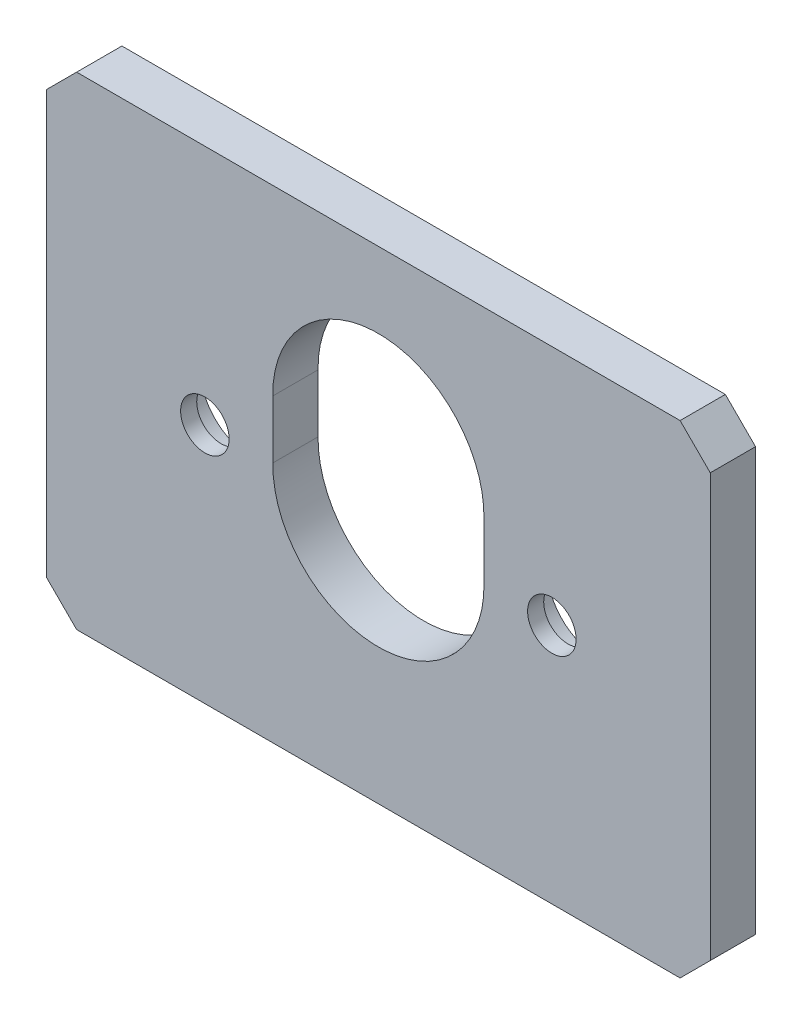
ISO-10303-21;
HEADER;
FILE_DESCRIPTION(('STEP AP214'),'2;1');
FILE_NAME('part.step','',(''),(''),'','','');
FILE_SCHEMA(('AUTOMOTIVE_DESIGN { 1 0 10303 214 1 1 1 1 }'));
ENDSEC;
DATA;
#1=APPLICATION_CONTEXT('core data for automotive mechanical design processes');
#2=APPLICATION_PROTOCOL_DEFINITION('international standard','automotive_design',2000,#1);
#3=PRODUCT_CONTEXT('',#1,'mechanical');
#4=PRODUCT('Part','Part','',(#3));
#5=PRODUCT_RELATED_PRODUCT_CATEGORY('part','',(#4));
#6=PRODUCT_DEFINITION_FORMATION('','',#4);
#7=PRODUCT_DEFINITION_CONTEXT('part definition',#1,'design');
#8=PRODUCT_DEFINITION('design','',#6,#7);
#9=PRODUCT_DEFINITION_SHAPE('','',#8);
#10=(LENGTH_UNIT() NAMED_UNIT(*) SI_UNIT(.MILLI.,.METRE.));
#11=(NAMED_UNIT(*) PLANE_ANGLE_UNIT() SI_UNIT($,.RADIAN.));
#12=(NAMED_UNIT(*) SI_UNIT($,.STERADIAN.) SOLID_ANGLE_UNIT());
#13=UNCERTAINTY_MEASURE_WITH_UNIT(LENGTH_MEASURE(1.E-05),#10,'distance_accuracy_value','');
#14=(GEOMETRIC_REPRESENTATION_CONTEXT(3) GLOBAL_UNCERTAINTY_ASSIGNED_CONTEXT((#13)) GLOBAL_UNIT_ASSIGNED_CONTEXT((#10,
#11,#12)) REPRESENTATION_CONTEXT('',''));
#15=CARTESIAN_POINT('',(0.,0.,0.));
#16=DIRECTION('',(0.,0.,1.));
#17=DIRECTION('',(1.,0.,0.));
#18=AXIS2_PLACEMENT_3D('',#15,#16,#17);
#19=CARTESIAN_POINT('',(707.110462480762,389.179264608464,2.38125));
#20=DIRECTION('',(0.,0.,1.));
#21=DIRECTION('',(1.,0.,0.));
#22=AXIS2_PLACEMENT_3D('',#19,#20,#21);
#23=CYLINDRICAL_SURFACE('',#22,2.5527);
#24=CARTESIAN_POINT('',(707.110462480762,389.179264608464,4.7625));
#25=DIRECTION('',(0.,0.,1.));
#26=DIRECTION('',(1.,0.,0.));
#27=AXIS2_PLACEMENT_3D('',#24,#25,#26);
#28=CIRCLE('',#27,2.5527);
#29=CARTESIAN_POINT('',(709.663162480762,389.179264608464,4.7625));
#30=VERTEX_POINT('',#29);
#31=EDGE_CURVE('E164',#30,#30,#28,.F.);
#32=ORIENTED_EDGE('',*,*,#31,.F.);
#33=EDGE_LOOP('',(#32));
#34=FACE_BOUND('',#33,.T.);
#35=CARTESIAN_POINT('',(707.110462480762,389.179264608464,3.06832));
#36=DIRECTION('',(0.,0.,-1.));
#37=DIRECTION('',(-1.,0.,0.));
#38=AXIS2_PLACEMENT_3D('',#35,#36,#37);
#39=CIRCLE('',#38,2.5527);
#40=CARTESIAN_POINT('',(704.557762480762,389.179264608464,3.06832));
#41=VERTEX_POINT('',#40);
#42=EDGE_CURVE('E43',#41,#41,#39,.F.);
#43=ORIENTED_EDGE('',*,*,#42,.F.);
#44=EDGE_LOOP('',(#43));
#45=FACE_BOUND('',#44,.T.);
#46=ADVANCED_FACE('F39',(#34,#45),#23,.F.);
#47=CARTESIAN_POINT('',(670.597962480762,389.179264608464,2.38125));
#48=DIRECTION('',(0.,0.,1.));
#49=DIRECTION('',(1.,0.,0.));
#50=AXIS2_PLACEMENT_3D('',#47,#48,#49);
#51=CYLINDRICAL_SURFACE('',#50,2.5527);
#52=CARTESIAN_POINT('',(670.597962480762,389.179264608464,4.7625));
#53=DIRECTION('',(0.,0.,1.));
#54=DIRECTION('',(1.,0.,0.));
#55=AXIS2_PLACEMENT_3D('',#52,#53,#54);
#56=CIRCLE('',#55,2.5527);
#57=CARTESIAN_POINT('',(673.150662480762,389.179264608464,4.7625));
#58=VERTEX_POINT('',#57);
#59=EDGE_CURVE('E161',#58,#58,#56,.F.);
#60=ORIENTED_EDGE('',*,*,#59,.F.);
#61=EDGE_LOOP('',(#60));
#62=FACE_BOUND('',#61,.T.);
#63=CARTESIAN_POINT('',(670.597962480762,389.179264608464,3.06832));
#64=DIRECTION('',(0.,0.,-1.));
#65=DIRECTION('',(-1.,0.,0.));
#66=AXIS2_PLACEMENT_3D('',#63,#64,#65);
#67=CIRCLE('',#66,2.5527);
#68=CARTESIAN_POINT('',(668.045262480762,389.179264608464,3.06832));
#69=VERTEX_POINT('',#68);
#70=EDGE_CURVE('E137',#69,#69,#67,.F.);
#71=ORIENTED_EDGE('',*,*,#70,.F.);
#72=EDGE_LOOP('',(#71));
#73=FACE_BOUND('',#72,.T.);
#74=ADVANCED_FACE('F287',(#62,#73),#51,.F.);
#75=CARTESIAN_POINT('',(688.854212480761,389.179264608464,0.));
#76=DIRECTION('',(0.,0.,1.));
#77=DIRECTION('',(1.,0.,0.));
#78=AXIS2_PLACEMENT_3D('',#75,#76,#77);
#79=PLANE('',#78);
#80=CARTESIAN_POINT('',(688.854212480761,395.529264608464,0.));
#81=DIRECTION('',(0.,0.,1.));
#82=DIRECTION('',(1.,0.,0.));
#83=AXIS2_PLACEMENT_3D('',#80,#81,#82);
#84=CIRCLE('',#83,11.1125);
#85=CARTESIAN_POINT('',(699.963010285383,395.242441342267,0.));
#86=VERTEX_POINT('',#85);
#87=CARTESIAN_POINT('',(677.742619883526,395.387256851397,0.));
#88=VERTEX_POINT('',#87);
#89=EDGE_CURVE('E168',#86,#88,#84,.T.);
#90=ORIENTED_EDGE('',*,*,#89,.T.);
#91=DIRECTION('',(-7.2259303567E-05,-0.999999997389297,0.));
#92=VECTOR('',#91,1.);
#93=CARTESIAN_POINT('',(677.742164059357,389.079084119593,0.));
#94=LINE('',#93,#92);
#95=CARTESIAN_POINT('',(677.742178653342,389.281050994053,0.));
#96=VERTEX_POINT('',#95);
#97=EDGE_CURVE('E83',#88,#96,#94,.T.);
#98=ORIENTED_EDGE('',*,*,#97,.T.);
#99=CARTESIAN_POINT('',(688.854212480761,389.179264608464,0.));
#100=DIRECTION('',(0.,0.,1.));
#101=DIRECTION('',(1.,0.,0.));
#102=AXIS2_PLACEMENT_3D('',#99,#100,#101);
#103=CIRCLE('',#102,11.1125);
#104=CARTESIAN_POINT('',(699.964756665355,389.387745236307,0.));
#105=VERTEX_POINT('',#104);
#106=EDGE_CURVE('E155',#96,#105,#103,.T.);
#107=ORIENTED_EDGE('',*,*,#106,.T.);
#108=DIRECTION('',(-0.000298287026866,0.999999955512424,0.));
#109=VECTOR('',#108,1.);
#110=CARTESIAN_POINT('',(699.962837197258,395.822715043866,0.));
#111=LINE('',#110,#109);
#112=EDGE_CURVE('E89',#105,#86,#111,.T.);
#113=ORIENTED_EDGE('',*,*,#112,.T.);
#114=EDGE_LOOP('',(#90,#98,#107,#113));
#115=FACE_BOUND('',#114,.T.);
#116=CARTESIAN_POINT('',(670.597962480762,389.179264608464,0.));
#117=DIRECTION('',(0.,0.,-1.));
#118=DIRECTION('',(-1.,0.,0.));
#119=AXIS2_PLACEMENT_3D('',#116,#117,#118);
#120=CIRCLE('',#119,5.21969999877492);
#121=CARTESIAN_POINT('',(665.378262481987,389.179264608464,0.));
#122=VERTEX_POINT('',#121);
#123=EDGE_CURVE('E181',#122,#122,#120,.T.);
#124=ORIENTED_EDGE('',*,*,#123,.F.);
#125=EDGE_LOOP('',(#124));
#126=FACE_BOUND('',#125,.T.);
#127=CARTESIAN_POINT('',(707.110462480762,389.179264608464,0.));
#128=DIRECTION('',(0.,0.,-1.));
#129=DIRECTION('',(-1.,0.,0.));
#130=AXIS2_PLACEMENT_3D('',#127,#128,#129);
#131=CIRCLE('',#130,5.21969999873288);
#132=CARTESIAN_POINT('',(701.890762482029,389.179264608464,0.));
#133=VERTEX_POINT('',#132);
#134=EDGE_CURVE('E189',#133,#133,#131,.T.);
#135=ORIENTED_EDGE('',*,*,#134,.F.);
#136=EDGE_LOOP('',(#135));
#137=FACE_BOUND('',#136,.T.);
#138=DIRECTION('',(1.,0.,0.));
#139=VECTOR('',#138,1.);
#140=CARTESIAN_POINT('',(653.929212480761,414.579264608464,0.));
#141=LINE('',#140,#139);
#142=CARTESIAN_POINT('',(720.604212480762,414.579264608464,0.));
#143=VERTEX_POINT('',#142);
#144=CARTESIAN_POINT('',(657.104212480761,414.579264608464,0.));
#145=VERTEX_POINT('',#144);
#146=EDGE_CURVE('E153',#143,#145,#141,.F.);
#147=ORIENTED_EDGE('',*,*,#146,.F.);
#148=DIRECTION('',(-0.70710678118654,0.707106781186555,0.));
#149=VECTOR('',#148,1.);
#150=CARTESIAN_POINT('',(722.191712480762,412.991764608464,0.));
#151=LINE('',#150,#149);
#152=CARTESIAN_POINT('',(723.779212480762,411.404264608464,0.));
#153=VERTEX_POINT('',#152);
#154=EDGE_CURVE('E97',#153,#143,#151,.T.);
#155=ORIENTED_EDGE('',*,*,#154,.F.);
#156=DIRECTION('',(0.,1.,0.));
#157=VECTOR('',#156,1.);
#158=CARTESIAN_POINT('',(723.779212480762,414.579264608464,0.));
#159=LINE('',#158,#157);
#160=CARTESIAN_POINT('',(723.779212480762,366.954264608464,0.));
#161=VERTEX_POINT('',#160);
#162=EDGE_CURVE('E227',#161,#153,#159,.T.);
#163=ORIENTED_EDGE('',*,*,#162,.F.);
#164=DIRECTION('',(0.70710678118654,0.707106781186555,0.));
#165=VECTOR('',#164,1.);
#166=CARTESIAN_POINT('',(722.191712480762,365.366764608464,0.));
#167=LINE('',#166,#165);
#168=CARTESIAN_POINT('',(720.604212480762,363.779264608464,0.));
#169=VERTEX_POINT('',#168);
#170=EDGE_CURVE('E232',#169,#161,#167,.T.);
#171=ORIENTED_EDGE('',*,*,#170,.F.);
#172=DIRECTION('',(1.,0.,0.));
#173=VECTOR('',#172,1.);
#174=CARTESIAN_POINT('',(723.779212480762,363.779264608464,0.));
#175=LINE('',#174,#173);
#176=CARTESIAN_POINT('',(657.104212480761,363.779264608464,0.));
#177=VERTEX_POINT('',#176);
#178=EDGE_CURVE('E237',#177,#169,#175,.T.);
#179=ORIENTED_EDGE('',*,*,#178,.F.);
#180=DIRECTION('',(0.70710678118654,-0.707106781186555,0.));
#181=VECTOR('',#180,1.);
#182=CARTESIAN_POINT('',(655.516712480761,365.366764608464,0.));
#183=LINE('',#182,#181);
#184=CARTESIAN_POINT('',(653.929212480761,366.954264608464,0.));
#185=VERTEX_POINT('',#184);
#186=EDGE_CURVE('E140',#185,#177,#183,.T.);
#187=ORIENTED_EDGE('',*,*,#186,.F.);
#188=DIRECTION('',(0.,1.,0.));
#189=VECTOR('',#188,1.);
#190=CARTESIAN_POINT('',(653.929212480761,363.779264608464,0.));
#191=LINE('',#190,#189);
#192=CARTESIAN_POINT('',(653.929212480761,411.404264608464,0.));
#193=VERTEX_POINT('',#192);
#194=EDGE_CURVE('E122',#193,#185,#191,.F.);
#195=ORIENTED_EDGE('',*,*,#194,.F.);
#196=DIRECTION('',(-0.70710678118654,-0.707106781186555,0.));
#197=VECTOR('',#196,1.);
#198=CARTESIAN_POINT('',(655.516712480761,412.991764608464,0.));
#199=LINE('',#198,#197);
#200=EDGE_CURVE('E128',#145,#193,#199,.T.);
#201=ORIENTED_EDGE('',*,*,#200,.F.);
#202=EDGE_LOOP('',(#147,#155,#163,#171,#179,#187,#195,#201));
#203=FACE_BOUND('',#202,.T.);
#204=ADVANCED_FACE('F41',(#115,#126,#137,#203),#79,.F.);
#205=CARTESIAN_POINT('',(655.516712480761,412.991764608464,0.));
#206=DIRECTION('',(-0.707106781186555,0.70710678118654,0.));
#207=DIRECTION('',(-0.70710678118654,-0.707106781186555,0.));
#208=AXIS2_PLACEMENT_3D('',#205,#206,#207);
#209=PLANE('',#208);
#210=ORIENTED_EDGE('',*,*,#200,.T.);
#211=DIRECTION('',(0.,0.,1.));
#212=VECTOR('',#211,1.);
#213=CARTESIAN_POINT('',(653.929212480761,411.404264608464,0.));
#214=LINE('',#213,#212);
#215=CARTESIAN_POINT('',(653.929212480761,411.404264608464,4.7625));
#216=VERTEX_POINT('',#215);
#217=EDGE_CURVE('E131',#216,#193,#214,.F.);
#218=ORIENTED_EDGE('',*,*,#217,.F.);
#219=DIRECTION('',(-0.707106781186541,-0.707106781186554,0.));
#220=VECTOR('',#219,1.);
#221=CARTESIAN_POINT('',(657.104212480761,414.579264608464,4.7625));
#222=LINE('',#221,#220);
#223=CARTESIAN_POINT('',(657.104212480761,414.579264608464,4.7625));
#224=VERTEX_POINT('',#223);
#225=EDGE_CURVE('E170',#224,#216,#222,.T.);
#226=ORIENTED_EDGE('',*,*,#225,.F.);
#227=DIRECTION('',(0.,0.,1.));
#228=VECTOR('',#227,1.);
#229=CARTESIAN_POINT('',(657.104212480761,414.579264608464,0.));
#230=LINE('',#229,#228);
#231=EDGE_CURVE('E134',#145,#224,#230,.T.);
#232=ORIENTED_EDGE('',*,*,#231,.F.);
#233=EDGE_LOOP('',(#210,#218,#226,#232));
#234=FACE_BOUND('',#233,.T.);
#235=ADVANCED_FACE('F129',(#234),#209,.T.);
#236=CARTESIAN_POINT('',(653.929212480761,363.779264608464,0.));
#237=DIRECTION('',(-1.,0.,0.));
#238=DIRECTION('',(0.,0.,1.));
#239=AXIS2_PLACEMENT_3D('',#236,#237,#238);
#240=PLANE('',#239);
#241=DIRECTION('',(0.,0.,1.));
#242=VECTOR('',#241,1.);
#243=CARTESIAN_POINT('',(653.929212480761,366.954264608464,0.));
#244=LINE('',#243,#242);
#245=CARTESIAN_POINT('',(653.929212480761,366.954264608464,4.7625));
#246=VERTEX_POINT('',#245);
#247=EDGE_CURVE('E142',#246,#185,#244,.F.);
#248=ORIENTED_EDGE('',*,*,#247,.F.);
#249=DIRECTION('',(0.,1.,0.));
#250=VECTOR('',#249,1.);
#251=CARTESIAN_POINT('',(653.929212480761,389.179264608464,4.7625));
#252=LINE('',#251,#250);
#253=EDGE_CURVE('E146',#216,#246,#252,.F.);
#254=ORIENTED_EDGE('',*,*,#253,.F.);
#255=ORIENTED_EDGE('',*,*,#217,.T.);
#256=ORIENTED_EDGE('',*,*,#194,.T.);
#257=EDGE_LOOP('',(#248,#254,#255,#256));
#258=FACE_BOUND('',#257,.T.);
#259=ADVANCED_FACE('F144',(#258),#240,.T.);
#260=CARTESIAN_POINT('',(655.516712480761,365.366764608464,0.));
#261=DIRECTION('',(-0.707106781186555,-0.70710678118654,0.));
#262=DIRECTION('',(0.70710678118654,-0.707106781186555,0.));
#263=AXIS2_PLACEMENT_3D('',#260,#261,#262);
#264=PLANE('',#263);
#265=ORIENTED_EDGE('',*,*,#186,.T.);
#266=DIRECTION('',(0.,0.,-1.));
#267=VECTOR('',#266,1.);
#268=CARTESIAN_POINT('',(657.104212480761,363.779264608464,0.));
#269=LINE('',#268,#267);
#270=CARTESIAN_POINT('',(657.104212480761,363.779264608464,4.7625));
#271=VERTEX_POINT('',#270);
#272=EDGE_CURVE('E239',#271,#177,#269,.T.);
#273=ORIENTED_EDGE('',*,*,#272,.F.);
#274=DIRECTION('',(0.707106781186541,-0.707106781186554,0.));
#275=VECTOR('',#274,1.);
#276=CARTESIAN_POINT('',(653.929212480761,366.954264608464,4.7625));
#277=LINE('',#276,#275);
#278=EDGE_CURVE('E210',#246,#271,#277,.T.);
#279=ORIENTED_EDGE('',*,*,#278,.F.);
#280=ORIENTED_EDGE('',*,*,#247,.T.);
#281=EDGE_LOOP('',(#265,#273,#279,#280));
#282=FACE_BOUND('',#281,.T.);
#283=ADVANCED_FACE('F244',(#282),#264,.T.);
#284=CARTESIAN_POINT('',(723.779212480762,363.779264608464,0.));
#285=DIRECTION('',(0.,-1.,0.));
#286=DIRECTION('',(0.,0.,-1.));
#287=AXIS2_PLACEMENT_3D('',#284,#285,#286);
#288=PLANE('',#287);
#289=DIRECTION('',(0.,0.,1.));
#290=VECTOR('',#289,1.);
#291=CARTESIAN_POINT('',(720.604212480762,363.779264608464,0.));
#292=LINE('',#291,#290);
#293=CARTESIAN_POINT('',(720.604212480762,363.779264608464,4.7625));
#294=VERTEX_POINT('',#293);
#295=EDGE_CURVE('E234',#294,#169,#292,.F.);
#296=ORIENTED_EDGE('',*,*,#295,.F.);
#297=DIRECTION('',(1.,0.,0.));
#298=VECTOR('',#297,1.);
#299=CARTESIAN_POINT('',(688.854212480761,363.779264608464,4.7625));
#300=LINE('',#299,#298);
#301=EDGE_CURVE('E207',#271,#294,#300,.T.);
#302=ORIENTED_EDGE('',*,*,#301,.F.);
#303=ORIENTED_EDGE('',*,*,#272,.T.);
#304=ORIENTED_EDGE('',*,*,#178,.T.);
#305=EDGE_LOOP('',(#296,#302,#303,#304));
#306=FACE_BOUND('',#305,.T.);
#307=ADVANCED_FACE('F272',(#306),#288,.T.);
#308=CARTESIAN_POINT('',(722.191712480762,365.366764608464,0.));
#309=DIRECTION('',(0.707106781186555,-0.70710678118654,0.));
#310=DIRECTION('',(0.70710678118654,0.707106781186555,0.));
#311=AXIS2_PLACEMENT_3D('',#308,#309,#310);
#312=PLANE('',#311);
#313=ORIENTED_EDGE('',*,*,#170,.T.);
#314=DIRECTION('',(0.,0.,-1.));
#315=VECTOR('',#314,1.);
#316=CARTESIAN_POINT('',(723.779212480762,366.954264608464,0.));
#317=LINE('',#316,#315);
#318=CARTESIAN_POINT('',(723.779212480762,366.954264608464,4.7625));
#319=VERTEX_POINT('',#318);
#320=EDGE_CURVE('E229',#319,#161,#317,.T.);
#321=ORIENTED_EDGE('',*,*,#320,.F.);
#322=DIRECTION('',(0.707106781186535,0.70710678118656,0.));
#323=VECTOR('',#322,1.);
#324=CARTESIAN_POINT('',(720.604212480762,363.779264608464,4.7625));
#325=LINE('',#324,#323);
#326=EDGE_CURVE('E204',#294,#319,#325,.T.);
#327=ORIENTED_EDGE('',*,*,#326,.F.);
#328=ORIENTED_EDGE('',*,*,#295,.T.);
#329=EDGE_LOOP('',(#313,#321,#327,#328));
#330=FACE_BOUND('',#329,.T.);
#331=ADVANCED_FACE('F275',(#330),#312,.T.);
#332=CARTESIAN_POINT('',(723.779212480762,414.579264608464,0.));
#333=DIRECTION('',(1.,0.,0.));
#334=DIRECTION('',(0.,0.,-1.));
#335=AXIS2_PLACEMENT_3D('',#332,#333,#334);
#336=PLANE('',#335);
#337=ORIENTED_EDGE('',*,*,#320,.T.);
#338=ORIENTED_EDGE('',*,*,#162,.T.);
#339=DIRECTION('',(0.,0.,1.));
#340=VECTOR('',#339,1.);
#341=CARTESIAN_POINT('',(723.779212480762,411.404264608464,0.));
#342=LINE('',#341,#340);
#343=CARTESIAN_POINT('',(723.779212480762,411.404264608464,4.7625));
#344=VERTEX_POINT('',#343);
#345=EDGE_CURVE('E225',#344,#153,#342,.F.);
#346=ORIENTED_EDGE('',*,*,#345,.F.);
#347=DIRECTION('',(0.,1.,0.));
#348=VECTOR('',#347,1.);
#349=CARTESIAN_POINT('',(723.779212480762,389.179264608464,4.7625));
#350=LINE('',#349,#348);
#351=EDGE_CURVE('E201',#319,#344,#350,.T.);
#352=ORIENTED_EDGE('',*,*,#351,.F.);
#353=EDGE_LOOP('',(#337,#338,#346,#352));
#354=FACE_BOUND('',#353,.T.);
#355=ADVANCED_FACE('F277',(#354),#336,.T.);
#356=CARTESIAN_POINT('',(722.191712480762,412.991764608464,0.));
#357=DIRECTION('',(0.707106781186555,0.70710678118654,0.));
#358=DIRECTION('',(-0.70710678118654,0.707106781186555,0.));
#359=AXIS2_PLACEMENT_3D('',#356,#357,#358);
#360=PLANE('',#359);
#361=ORIENTED_EDGE('',*,*,#154,.T.);
#362=DIRECTION('',(0.,0.,1.));
#363=VECTOR('',#362,1.);
#364=CARTESIAN_POINT('',(720.604212480762,414.579264608464,0.));
#365=LINE('',#364,#363);
#366=CARTESIAN_POINT('',(720.604212480762,414.579264608464,4.7625));
#367=VERTEX_POINT('',#366);
#368=EDGE_CURVE('E220',#367,#143,#365,.F.);
#369=ORIENTED_EDGE('',*,*,#368,.F.);
#370=DIRECTION('',(-0.707106781186535,0.70710678118656,0.));
#371=VECTOR('',#370,1.);
#372=CARTESIAN_POINT('',(723.779212480762,411.404264608464,4.7625));
#373=LINE('',#372,#371);
#374=EDGE_CURVE('E198',#344,#367,#373,.T.);
#375=ORIENTED_EDGE('',*,*,#374,.F.);
#376=ORIENTED_EDGE('',*,*,#345,.T.);
#377=EDGE_LOOP('',(#361,#369,#375,#376));
#378=FACE_BOUND('',#377,.T.);
#379=ADVANCED_FACE('F261',(#378),#360,.T.);
#380=CARTESIAN_POINT('',(653.929212480761,414.579264608464,0.));
#381=DIRECTION('',(0.,1.,0.));
#382=DIRECTION('',(0.,0.,1.));
#383=AXIS2_PLACEMENT_3D('',#380,#381,#382);
#384=PLANE('',#383);
#385=ORIENTED_EDGE('',*,*,#368,.T.);
#386=ORIENTED_EDGE('',*,*,#146,.T.);
#387=ORIENTED_EDGE('',*,*,#231,.T.);
#388=DIRECTION('',(1.,0.,0.));
#389=VECTOR('',#388,1.);
#390=CARTESIAN_POINT('',(688.854212480761,414.579264608464,4.7625));
#391=LINE('',#390,#389);
#392=EDGE_CURVE('E167',#367,#224,#391,.F.);
#393=ORIENTED_EDGE('',*,*,#392,.F.);
#394=EDGE_LOOP('',(#385,#386,#387,#393));
#395=FACE_BOUND('',#394,.T.);
#396=ADVANCED_FACE('F255',(#395),#384,.T.);
#397=CARTESIAN_POINT('',(699.962837197258,395.822715043866,0.));
#398=DIRECTION('',(0.999999955512424,0.000298287026866,0.));
#399=DIRECTION('',(-0.000298287026866,0.999999955512424,0.));
#400=AXIS2_PLACEMENT_3D('',#397,#398,#399);
#401=PLANE('',#400);
#402=DIRECTION('',(0.000298287026858752,-0.999999955512424,0.));
#403=VECTOR('',#402,1.);
#404=CARTESIAN_POINT('',(699.963010285383,395.242441342268,4.7625));
#405=LINE('',#404,#403);
#406=CARTESIAN_POINT('',(699.963010285383,395.242441342268,4.7625));
#407=VERTEX_POINT('',#406);
#408=CARTESIAN_POINT('',(699.964756665355,389.387745236307,4.7625));
#409=VERTEX_POINT('',#408);
#410=EDGE_CURVE('E160',#407,#409,#405,.T.);
#411=ORIENTED_EDGE('',*,*,#410,.F.);
#412=DIRECTION('',(0.,0.,1.));
#413=VECTOR('',#412,1.);
#414=CARTESIAN_POINT('',(699.963010285383,395.242441342268,0.));
#415=LINE('',#414,#413);
#416=EDGE_CURVE('E171',#407,#86,#415,.F.);
#417=ORIENTED_EDGE('',*,*,#416,.T.);
#418=ORIENTED_EDGE('',*,*,#112,.F.);
#419=DIRECTION('',(0.,0.,1.));
#420=VECTOR('',#419,1.);
#421=CARTESIAN_POINT('',(699.964756665355,389.387745236304,0.));
#422=LINE('',#421,#420);
#423=EDGE_CURVE('E152',#105,#409,#422,.T.);
#424=ORIENTED_EDGE('',*,*,#423,.T.);
#425=EDGE_LOOP('',(#411,#417,#418,#424));
#426=FACE_BOUND('',#425,.T.);
#427=ADVANCED_FACE('F300',(#426),#401,.F.);
#428=CARTESIAN_POINT('',(688.854212480761,389.179264608464,0.));
#429=DIRECTION('',(0.,0.,1.));
#430=DIRECTION('',(1.,0.,0.));
#431=AXIS2_PLACEMENT_3D('',#428,#429,#430);
#432=CYLINDRICAL_SURFACE('',#431,11.1125);
#433=DIRECTION('',(0.,0.,1.));
#434=VECTOR('',#433,1.);
#435=CARTESIAN_POINT('',(677.742178653342,389.281050994048,0.));
#436=LINE('',#435,#434);
#437=CARTESIAN_POINT('',(677.742178653342,389.281050994045,4.7625));
#438=VERTEX_POINT('',#437);
#439=EDGE_CURVE('E154',#96,#438,#436,.T.);
#440=ORIENTED_EDGE('',*,*,#439,.T.);
#441=CARTESIAN_POINT('',(688.854212480761,389.179264608464,4.7625));
#442=DIRECTION('',(0.,0.,1.));
#443=DIRECTION('',(1.,0.,0.));
#444=AXIS2_PLACEMENT_3D('',#441,#442,#443);
#445=CIRCLE('',#444,11.1125);
#446=EDGE_CURVE('E157',#409,#438,#445,.F.);
#447=ORIENTED_EDGE('',*,*,#446,.F.);
#448=ORIENTED_EDGE('',*,*,#423,.F.);
#449=ORIENTED_EDGE('',*,*,#106,.F.);
#450=EDGE_LOOP('',(#440,#447,#448,#449));
#451=FACE_BOUND('',#450,.T.);
#452=ADVANCED_FACE('F304',(#451),#432,.F.);
#453=CARTESIAN_POINT('',(677.742164059357,389.079084119593,0.));
#454=DIRECTION('',(-0.999999997389297,7.2259303567E-05,0.));
#455=DIRECTION('',(-7.2259303567E-05,-0.999999997389297,0.));
#456=AXIS2_PLACEMENT_3D('',#453,#454,#455);
#457=PLANE('',#456);
#458=ORIENTED_EDGE('',*,*,#97,.F.);
#459=DIRECTION('',(0.,0.,1.));
#460=VECTOR('',#459,1.);
#461=CARTESIAN_POINT('',(677.742619883526,395.387256851398,0.));
#462=LINE('',#461,#460);
#463=CARTESIAN_POINT('',(677.742619883526,395.387256851399,4.7625));
#464=VERTEX_POINT('',#463);
#465=EDGE_CURVE('E58',#88,#464,#462,.T.);
#466=ORIENTED_EDGE('',*,*,#465,.T.);
#467=DIRECTION('',(7.22593035841051E-05,0.999999997389297,0.));
#468=VECTOR('',#467,1.);
#469=CARTESIAN_POINT('',(677.742178653342,389.281050994048,4.7625));
#470=LINE('',#469,#468);
#471=EDGE_CURVE('E49',#438,#464,#470,.T.);
#472=ORIENTED_EDGE('',*,*,#471,.F.);
#473=ORIENTED_EDGE('',*,*,#439,.F.);
#474=EDGE_LOOP('',(#458,#466,#472,#473));
#475=FACE_BOUND('',#474,.T.);
#476=ADVANCED_FACE('F308',(#475),#457,.F.);
#477=CARTESIAN_POINT('',(688.854212480761,395.529264608464,0.));
#478=DIRECTION('',(0.,0.,1.));
#479=DIRECTION('',(1.,0.,0.));
#480=AXIS2_PLACEMENT_3D('',#477,#478,#479);
#481=CYLINDRICAL_SURFACE('',#480,11.1125);
#482=ORIENTED_EDGE('',*,*,#416,.F.);
#483=CARTESIAN_POINT('',(688.854212480761,395.529264608464,4.7625));
#484=DIRECTION('',(0.,0.,1.));
#485=DIRECTION('',(1.,0.,0.));
#486=AXIS2_PLACEMENT_3D('',#483,#484,#485);
#487=CIRCLE('',#486,11.1125);
#488=EDGE_CURVE('E12',#464,#407,#487,.F.);
#489=ORIENTED_EDGE('',*,*,#488,.F.);
#490=ORIENTED_EDGE('',*,*,#465,.F.);
#491=ORIENTED_EDGE('',*,*,#89,.F.);
#492=EDGE_LOOP('',(#482,#489,#490,#491));
#493=FACE_BOUND('',#492,.T.);
#494=ADVANCED_FACE('F314',(#493),#481,.F.);
#495=CARTESIAN_POINT('',(688.854212480761,389.179264608464,4.7625));
#496=DIRECTION('',(0.,0.,1.));
#497=DIRECTION('',(1.,0.,0.));
#498=AXIS2_PLACEMENT_3D('',#495,#496,#497);
#499=PLANE('',#498);
#500=ORIENTED_EDGE('',*,*,#471,.T.);
#501=ORIENTED_EDGE('',*,*,#488,.T.);
#502=ORIENTED_EDGE('',*,*,#410,.T.);
#503=ORIENTED_EDGE('',*,*,#446,.T.);
#504=EDGE_LOOP('',(#500,#501,#502,#503));
#505=FACE_BOUND('',#504,.T.);
#506=ORIENTED_EDGE('',*,*,#59,.T.);
#507=EDGE_LOOP('',(#506));
#508=FACE_BOUND('',#507,.T.);
#509=ORIENTED_EDGE('',*,*,#31,.T.);
#510=EDGE_LOOP('',(#509));
#511=FACE_BOUND('',#510,.T.);
#512=ORIENTED_EDGE('',*,*,#374,.T.);
#513=ORIENTED_EDGE('',*,*,#392,.T.);
#514=ORIENTED_EDGE('',*,*,#225,.T.);
#515=ORIENTED_EDGE('',*,*,#253,.T.);
#516=ORIENTED_EDGE('',*,*,#278,.T.);
#517=ORIENTED_EDGE('',*,*,#301,.T.);
#518=ORIENTED_EDGE('',*,*,#326,.T.);
#519=ORIENTED_EDGE('',*,*,#351,.T.);
#520=EDGE_LOOP('',(#512,#513,#514,#515,#516,#517,#518,#519));
#521=FACE_BOUND('',#520,.T.);
#522=ADVANCED_FACE('F256',(#505,#508,#511,#521),#499,.T.);
#523=CARTESIAN_POINT('',(670.597962480762,389.179264608464,3.06832));
#524=DIRECTION('',(0.,0.,-1.));
#525=DIRECTION('',(-1.,0.,0.));
#526=AXIS2_PLACEMENT_3D('',#523,#524,#525);
#527=PLANE('',#526);
#528=CARTESIAN_POINT('',(670.597962480762,389.179264608464,3.06832));
#529=DIRECTION('',(0.,0.,-1.));
#530=DIRECTION('',(-1.,0.,0.));
#531=AXIS2_PLACEMENT_3D('',#528,#529,#530);
#532=CIRCLE('',#531,5.21969999877492);
#533=CARTESIAN_POINT('',(665.378262481987,389.179264608464,3.06832));
#534=VERTEX_POINT('',#533);
#535=EDGE_CURVE('E175',#534,#534,#532,.T.);
#536=ORIENTED_EDGE('',*,*,#535,.T.);
#537=EDGE_LOOP('',(#536));
#538=FACE_BOUND('',#537,.T.);
#539=ORIENTED_EDGE('',*,*,#70,.T.);
#540=EDGE_LOOP('',(#539));
#541=FACE_BOUND('',#540,.T.);
#542=ADVANCED_FACE('F320',(#538,#541),#527,.T.);
#543=CARTESIAN_POINT('',(670.597962480762,389.179264608464,3.06832));
#544=DIRECTION('',(0.,0.,-1.));
#545=DIRECTION('',(-1.,0.,0.));
#546=AXIS2_PLACEMENT_3D('',#543,#544,#545);
#547=CYLINDRICAL_SURFACE('',#546,5.21969999877492);
#548=ORIENTED_EDGE('',*,*,#535,.F.);
#549=EDGE_LOOP('',(#548));
#550=FACE_BOUND('',#549,.T.);
#551=ORIENTED_EDGE('',*,*,#123,.T.);
#552=EDGE_LOOP('',(#551));
#553=FACE_BOUND('',#552,.T.);
#554=ADVANCED_FACE('F322',(#550,#553),#547,.F.);
#555=CARTESIAN_POINT('',(707.110462480762,389.179264608464,3.06832));
#556=DIRECTION('',(0.,0.,-1.));
#557=DIRECTION('',(-1.,0.,0.));
#558=AXIS2_PLACEMENT_3D('',#555,#556,#557);
#559=PLANE('',#558);
#560=CARTESIAN_POINT('',(707.110462480762,389.179264608464,3.06832));
#561=DIRECTION('',(0.,0.,-1.));
#562=DIRECTION('',(-1.,0.,0.));
#563=AXIS2_PLACEMENT_3D('',#560,#561,#562);
#564=CIRCLE('',#563,5.21969999873288);
#565=CARTESIAN_POINT('',(701.890762482029,389.179264608464,3.06832));
#566=VERTEX_POINT('',#565);
#567=EDGE_CURVE('E340',#566,#566,#564,.T.);
#568=ORIENTED_EDGE('',*,*,#567,.T.);
#569=EDGE_LOOP('',(#568));
#570=FACE_BOUND('',#569,.T.);
#571=ORIENTED_EDGE('',*,*,#42,.T.);
#572=EDGE_LOOP('',(#571));
#573=FACE_BOUND('',#572,.T.);
#574=ADVANCED_FACE('F325',(#570,#573),#559,.T.);
#575=CARTESIAN_POINT('',(707.110462480762,389.179264608464,3.06832));
#576=DIRECTION('',(0.,0.,-1.));
#577=DIRECTION('',(-1.,0.,0.));
#578=AXIS2_PLACEMENT_3D('',#575,#576,#577);
#579=CYLINDRICAL_SURFACE('',#578,5.21969999873288);
#580=ORIENTED_EDGE('',*,*,#567,.F.);
#581=EDGE_LOOP('',(#580));
#582=FACE_BOUND('',#581,.T.);
#583=ORIENTED_EDGE('',*,*,#134,.T.);
#584=EDGE_LOOP('',(#583));
#585=FACE_BOUND('',#584,.T.);
#586=ADVANCED_FACE('F329',(#582,#585),#579,.F.);
#587=CLOSED_SHELL('',(#46,#74,#204,#235,#259,#283,#307,#331,#355,#379,#396,#427,#452,#476,#494,
#522,#542,#554,#574,#586));
#588=MANIFOLD_SOLID_BREP('B2',#587);
#589=ADVANCED_BREP_SHAPE_REPRESENTATION('',(#18,#588),#14);
#590=SHAPE_DEFINITION_REPRESENTATION(#9,#589);
ENDSEC;
END-ISO-10303-21;
